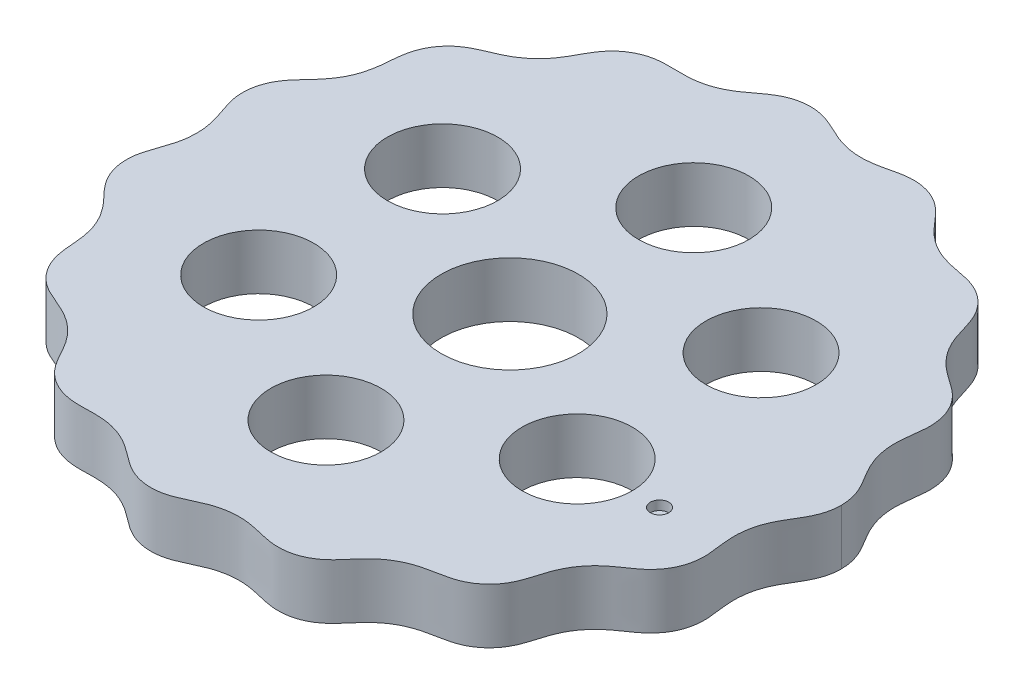
ISO-10303-21;
HEADER;
FILE_DESCRIPTION(('STEP AP214'),'2;1');
FILE_NAME('part.step','',(''),(''),'','','');
FILE_SCHEMA(('AUTOMOTIVE_DESIGN { 1 0 10303 214 1 1 1 1 }'));
ENDSEC;
DATA;
#1=APPLICATION_CONTEXT('core data for automotive mechanical design processes');
#2=APPLICATION_PROTOCOL_DEFINITION('international standard','automotive_design',2000,#1);
#3=PRODUCT_CONTEXT('',#1,'mechanical');
#4=PRODUCT('Part','Part','',(#3));
#5=PRODUCT_RELATED_PRODUCT_CATEGORY('part','',(#4));
#6=PRODUCT_DEFINITION_FORMATION('','',#4);
#7=PRODUCT_DEFINITION_CONTEXT('part definition',#1,'design');
#8=PRODUCT_DEFINITION('design','',#6,#7);
#9=PRODUCT_DEFINITION_SHAPE('','',#8);
#10=(LENGTH_UNIT() NAMED_UNIT(*) SI_UNIT(.MILLI.,.METRE.));
#11=(NAMED_UNIT(*) PLANE_ANGLE_UNIT() SI_UNIT($,.RADIAN.));
#12=(NAMED_UNIT(*) SI_UNIT($,.STERADIAN.) SOLID_ANGLE_UNIT());
#13=UNCERTAINTY_MEASURE_WITH_UNIT(LENGTH_MEASURE(1.E-05),#10,'distance_accuracy_value','');
#14=(GEOMETRIC_REPRESENTATION_CONTEXT(3) GLOBAL_UNCERTAINTY_ASSIGNED_CONTEXT((#13)) GLOBAL_UNIT_ASSIGNED_CONTEXT((#10,
#11,#12)) REPRESENTATION_CONTEXT('',''));
#15=CARTESIAN_POINT('',(0.,0.,0.));
#16=DIRECTION('',(0.,0.,1.));
#17=DIRECTION('',(1.,0.,0.));
#18=AXIS2_PLACEMENT_3D('',#15,#16,#17);
#19=CARTESIAN_POINT('',(-35.05,6.,9.32696218690527E-12));
#20=CARTESIAN_POINT('',(-35.0499999998892,6.,0.594198712220902));
#21=CARTESIAN_POINT('',(-35.1913465120562,6.,1.78711982767264));
#22=CARTESIAN_POINT('',(-35.7745737882899,6.,3.47963326521063));
#23=CARTESIAN_POINT('',(-36.370656392762,6.,5.19330738173192));
#24=CARTESIAN_POINT('',(-36.4395745059833,6.,7.03029588725489));
#25=CARTESIAN_POINT('',(-35.9254904949425,6.,8.79622364001885));
#26=CARTESIAN_POINT('',(-34.8762951438896,6.,10.2952756537674));
#27=CARTESIAN_POINT('',(-33.5854700617784,6.,11.5493162046679));
#28=CARTESIAN_POINT('',(-32.4877066627104,6.,12.9692487656192));
#29=CARTESIAN_POINT('',(-31.7429571439539,6.,14.6069888477062));
#30=CARTESIAN_POINT('',(-31.3965653966145,6.,16.3684571477443));
#31=CARTESIAN_POINT('',(-31.3265352886967,6.,18.1655890316743));
#32=CARTESIAN_POINT('',(-30.9526112903441,6.,19.9544631608531));
#33=CARTESIAN_POINT('',(-30.0177309342568,6.,21.5384719808491));
#34=CARTESIAN_POINT('',(-28.6321107294511,6.,22.7474902594258));
#35=CARTESIAN_POINT('',(-26.9684972059925,6.,23.4758048945092));
#36=CARTESIAN_POINT('',(-24.7570576622411,6.,24.3803877936909));
#37=CARTESIAN_POINT('',(-22.9112517705363,6.,25.9835895465123));
#38=CARTESIAN_POINT('',(-21.7348969348737,6.,28.0634777360799));
#39=CARTESIAN_POINT('',(-20.8793460189135,6.,29.6605139568622));
#40=CARTESIAN_POINT('',(-19.5893345538051,6.,30.9697358449682));
#41=CARTESIAN_POINT('',(-17.9506188599872,6.,31.8040646366244));
#42=CARTESIAN_POINT('',(-16.1381628593216,6.,32.0666998195313));
#43=CARTESIAN_POINT('',(-14.3403811434947,6.,31.9481438558153));
#44=CARTESIAN_POINT('',(-12.5497470424179,6.,32.0565924432155));
#45=CARTESIAN_POINT('',(-10.825868457719,6.,32.5716843435534));
#46=CARTESIAN_POINT('',(-9.27045661127403,6.,33.470271575087));
#47=CARTESIAN_POINT('',(-7.88735838734216,6.,34.6160917158558));
#48=CARTESIAN_POINT('',(-6.32792326907632,6.,35.566471434636));
#49=CARTESIAN_POINT('',(-4.53328198655415,6.,35.9699050702021));
#50=CARTESIAN_POINT('',(-2.70292921010654,6.,35.7895233497481));
#51=CARTESIAN_POINT('',(-1.03579759542578,6.,35.0636998469043));
#52=CARTESIAN_POINT('',(0.572152539145945,6.,34.2736511031319));
#53=CARTESIAN_POINT('',(2.31315420309511,6.,33.822136750088));
#54=CARTESIAN_POINT('',(4.11223072383569,6.,33.7899259876357));
#55=CARTESIAN_POINT('',(5.86627955125585,6.,34.1520112916324));
#56=CARTESIAN_POINT('',(7.61907713235213,6.,34.6037655657108));
#57=CARTESIAN_POINT('',(9.45536171394892,6.,34.5618632272122));
#58=CARTESIAN_POINT('',(11.1856343970663,6.,33.9385608736506));
#59=CARTESIAN_POINT('',(12.6200769235361,6.,32.7974342126942));
#60=CARTESIAN_POINT('',(13.7402024322461,6.,31.3837399155461));
#61=CARTESIAN_POINT('',(15.0003772119089,6.,30.1081805798537));
#62=CARTESIAN_POINT('',(16.5216437127923,6.,29.1475096031536));
#63=CARTESIAN_POINT('',(18.2225137560446,6.,28.5671554071713));
#64=CARTESIAN_POINT('',(19.996356323046,6.,28.2983181896908));
#65=CARTESIAN_POINT('',(22.3427942462049,6.,27.6504260298381));
#66=CARTESIAN_POINT('',(24.2011714080777,6.,25.896958922492));
#67=CARTESIAN_POINT('',(25.0056239565397,6.,23.6053486952171));
#68=CARTESIAN_POINT('',(25.4804410916593,6.,21.8774790408125));
#69=CARTESIAN_POINT('',(26.2849706752904,6.,20.2692714737283));
#70=CARTESIAN_POINT('',(27.4434246095972,6.,18.8926486785662));
#71=CARTESIAN_POINT('',(28.8726076272551,6.,17.8118803078229));
#72=CARTESIAN_POINT('',(30.3879451239351,6.,16.825917608955));
#73=CARTESIAN_POINT('',(31.6155427164027,6.,15.4611393344032));
#74=CARTESIAN_POINT('',(32.3457918338397,6.,13.7734509022635));
#75=CARTESIAN_POINT('',(32.4979162013361,6.,11.945393512076));
#76=CARTESIAN_POINT('',(32.204983179982,6.,10.1635179830524));
#77=CARTESIAN_POINT('',(32.0757754972111,6.,8.37582766732209));
#78=CARTESIAN_POINT('',(32.3517418709203,6.,6.59786117174831));
#79=CARTESIAN_POINT('',(33.0335892363525,6.,4.93469078106266));
#80=CARTESIAN_POINT('',(34.0120354721736,6.,3.43122980617509));
#81=CARTESIAN_POINT('',(34.8553368030006,6.,1.81785079322302));
#82=CARTESIAN_POINT('',(35.0500000000165,6.,0.601878761075715));
#83=CARTESIAN_POINT('',(35.05,6.,-1.36507195783586E-12));
#84=B_SPLINE_CURVE_WITH_KNOTS('',3,(#19,#20,#21,#22,#23,#24,#25,#26,#27,#28,#29,#30,#31,#32,#33,
#34,#35,#36,#37,#38,#39,#40,#41,#42,#43,#44,#45,#46,#47,#48,#49,#50,#51,#52,#53,#54,#55,#56,#57,
#58,#59,#60,#61,#62,#63,#64,#65,#66,#67,#68,#69,#70,#71,#72,#73,#74,#75,#76,#77,#78,#79,#80,#81,
#82,#83),.UNSPECIFIED.,.F.,.F.,(4,1,1,1,1,1,1,1,1,1,1,1,1,1,1,1,1,1,1,1,1,1,1,1,1,1,1,1,1,1,1,1,
1,1,1,1,1,1,1,1,1,1,1,1,1,1,1,1,1,1,1,1,1,1,1,1,1,1,1,1,1,1,4),(0.0723695662334952,
0.0856649243269336,0.0989602824203721,0.112255640513811,0.125550998607249,0.138846356700688,
0.152141714794126,0.165437072887564,0.178732430981003,0.192027789074441,0.20532314716788,
0.218618505261318,0.231913863354757,0.245209221448195,0.258504579541634,0.271799937635072,
0.285095295728511,0.311686011915388,0.324981370008826,0.338276728102265,0.351572086195703,
0.364867444289141,0.37816280238258,0.391458160476018,0.404753518569457,0.418048876662895,
0.431344234756334,0.444639592849772,0.457934950943211,0.471230309036649,0.484525667130088,
0.497821025223526,0.511116383316965,0.524411741410403,0.537707099503842,0.55100245759728,
0.564297815690718,0.577593173784157,0.590888531877595,0.604183889971034,0.617479248064472,
0.630774606157911,0.644069964251349,0.657365322344788,0.670660680438226,0.683956038531665,
0.710546754718541,0.72384211281198,0.737137470905418,0.750432828998857,0.763728187092295,
0.777023545185734,0.790318903279172,0.803614261372611,0.816909619466049,0.830204977559488,
0.843500335652926,0.856795693746365,0.870091051839803,0.883386409933242,0.89668176802668,
0.909977126120118,0.923272484213557),.UNSPECIFIED.);
#85=DIRECTION('',(0.,-1.,0.));
#86=VECTOR('',#85,1.);
#87=SURFACE_OF_LINEAR_EXTRUSION('',#84,#86);
#88=CARTESIAN_POINT('',(-35.05,0.,9.32696218690527E-12));
#89=CARTESIAN_POINT('',(-35.0499999998892,0.,0.594198712220902));
#90=CARTESIAN_POINT('',(-35.1913465120562,0.,1.78711982767264));
#91=CARTESIAN_POINT('',(-35.7745737882899,0.,3.47963326521063));
#92=CARTESIAN_POINT('',(-36.370656392762,0.,5.19330738173192));
#93=CARTESIAN_POINT('',(-36.4395745059833,0.,7.03029588725489));
#94=CARTESIAN_POINT('',(-35.9254904949425,0.,8.79622364001885));
#95=CARTESIAN_POINT('',(-34.8762951438896,0.,10.2952756537674));
#96=CARTESIAN_POINT('',(-33.5854700617784,0.,11.5493162046679));
#97=CARTESIAN_POINT('',(-32.4877066627104,0.,12.9692487656192));
#98=CARTESIAN_POINT('',(-31.7429571439539,0.,14.6069888477062));
#99=CARTESIAN_POINT('',(-31.3965653966145,0.,16.3684571477443));
#100=CARTESIAN_POINT('',(-31.3265352886967,0.,18.1655890316743));
#101=CARTESIAN_POINT('',(-30.9526112903441,0.,19.9544631608531));
#102=CARTESIAN_POINT('',(-30.0177309342568,0.,21.5384719808491));
#103=CARTESIAN_POINT('',(-28.6321107294511,0.,22.7474902594258));
#104=CARTESIAN_POINT('',(-26.9684972059925,0.,23.4758048945092));
#105=CARTESIAN_POINT('',(-24.7570576622411,0.,24.3803877936909));
#106=CARTESIAN_POINT('',(-22.9112517705363,0.,25.9835895465123));
#107=CARTESIAN_POINT('',(-21.7348969348737,0.,28.0634777360799));
#108=CARTESIAN_POINT('',(-20.8793460189135,0.,29.6605139568622));
#109=CARTESIAN_POINT('',(-19.5893345538051,0.,30.9697358449682));
#110=CARTESIAN_POINT('',(-17.9506188599872,0.,31.8040646366244));
#111=CARTESIAN_POINT('',(-16.1381628593216,0.,32.0666998195313));
#112=CARTESIAN_POINT('',(-14.3403811434947,0.,31.9481438558153));
#113=CARTESIAN_POINT('',(-12.5497470424179,0.,32.0565924432155));
#114=CARTESIAN_POINT('',(-10.825868457719,0.,32.5716843435534));
#115=CARTESIAN_POINT('',(-9.27045661127403,0.,33.470271575087));
#116=CARTESIAN_POINT('',(-7.88735838734216,0.,34.6160917158558));
#117=CARTESIAN_POINT('',(-6.32792326907632,0.,35.566471434636));
#118=CARTESIAN_POINT('',(-4.53328198655415,0.,35.9699050702021));
#119=CARTESIAN_POINT('',(-2.70292921010654,0.,35.7895233497481));
#120=CARTESIAN_POINT('',(-1.03579759542578,0.,35.0636998469043));
#121=CARTESIAN_POINT('',(0.572152539145945,0.,34.2736511031319));
#122=CARTESIAN_POINT('',(2.31315420309511,0.,33.822136750088));
#123=CARTESIAN_POINT('',(4.11223072383569,0.,33.7899259876357));
#124=CARTESIAN_POINT('',(5.86627955125585,0.,34.1520112916324));
#125=CARTESIAN_POINT('',(7.61907713235213,0.,34.6037655657108));
#126=CARTESIAN_POINT('',(9.45536171394892,0.,34.5618632272122));
#127=CARTESIAN_POINT('',(11.1856343970663,0.,33.9385608736506));
#128=CARTESIAN_POINT('',(12.6200769235361,0.,32.7974342126942));
#129=CARTESIAN_POINT('',(13.7402024322461,0.,31.3837399155461));
#130=CARTESIAN_POINT('',(15.0003772119089,0.,30.1081805798537));
#131=CARTESIAN_POINT('',(16.5216437127923,0.,29.1475096031536));
#132=CARTESIAN_POINT('',(18.2225137560446,0.,28.5671554071713));
#133=CARTESIAN_POINT('',(19.996356323046,0.,28.2983181896908));
#134=CARTESIAN_POINT('',(22.3427942462049,0.,27.6504260298381));
#135=CARTESIAN_POINT('',(24.2011714080777,0.,25.896958922492));
#136=CARTESIAN_POINT('',(25.0056239565397,0.,23.6053486952171));
#137=CARTESIAN_POINT('',(25.4804410916593,0.,21.8774790408125));
#138=CARTESIAN_POINT('',(26.2849706752904,0.,20.2692714737283));
#139=CARTESIAN_POINT('',(27.4434246095972,0.,18.8926486785662));
#140=CARTESIAN_POINT('',(28.8726076272551,0.,17.8118803078229));
#141=CARTESIAN_POINT('',(30.3879451239351,0.,16.825917608955));
#142=CARTESIAN_POINT('',(31.6155427164027,0.,15.4611393344032));
#143=CARTESIAN_POINT('',(32.3457918338397,0.,13.7734509022635));
#144=CARTESIAN_POINT('',(32.4979162013361,0.,11.945393512076));
#145=CARTESIAN_POINT('',(32.204983179982,0.,10.1635179830524));
#146=CARTESIAN_POINT('',(32.0757754972111,0.,8.37582766732209));
#147=CARTESIAN_POINT('',(32.3517418709203,0.,6.59786117174831));
#148=CARTESIAN_POINT('',(33.0335892363525,0.,4.93469078106266));
#149=CARTESIAN_POINT('',(34.0120354721736,0.,3.43122980617509));
#150=CARTESIAN_POINT('',(34.8553368030006,0.,1.81785079322302));
#151=CARTESIAN_POINT('',(35.0500000000165,0.,0.601878761075715));
#152=CARTESIAN_POINT('',(35.05,0.,-1.36507195783586E-12));
#153=B_SPLINE_CURVE_WITH_KNOTS('',3,(#88,#89,#90,#91,#92,#93,#94,#95,#96,#97,#98,#99,#100,#101,
#102,#103,#104,#105,#106,#107,#108,#109,#110,#111,#112,#113,#114,#115,#116,#117,#118,#119,#120,
#121,#122,#123,#124,#125,#126,#127,#128,#129,#130,#131,#132,#133,#134,#135,#136,#137,#138,#139,
#140,#141,#142,#143,#144,#145,#146,#147,#148,#149,#150,#151,#152),.UNSPECIFIED.,.F.,.F.,(4,1,1,
1,1,1,1,1,1,1,1,1,1,1,1,1,1,1,1,1,1,1,1,1,1,1,1,1,1,1,1,1,1,1,1,1,1,1,1,1,1,1,1,1,1,1,1,1,1,1,1,
1,1,1,1,1,1,1,1,1,1,1,4),(0.0723695662334952,0.0856649243269336,0.0989602824203721,
0.112255640513811,0.125550998607249,0.138846356700688,0.152141714794126,0.165437072887564,
0.178732430981003,0.192027789074441,0.20532314716788,0.218618505261318,0.231913863354757,
0.245209221448195,0.258504579541634,0.271799937635072,0.285095295728511,0.311686011915388,
0.324981370008826,0.338276728102265,0.351572086195703,0.364867444289141,0.37816280238258,
0.391458160476018,0.404753518569457,0.418048876662895,0.431344234756334,0.444639592849772,
0.457934950943211,0.471230309036649,0.484525667130088,0.497821025223526,0.511116383316965,
0.524411741410403,0.537707099503842,0.55100245759728,0.564297815690718,0.577593173784157,
0.590888531877595,0.604183889971034,0.617479248064472,0.630774606157911,0.644069964251349,
0.657365322344788,0.670660680438226,0.683956038531665,0.710546754718541,0.72384211281198,
0.737137470905418,0.750432828998857,0.763728187092295,0.777023545185734,0.790318903279172,
0.803614261372611,0.816909619466049,0.830204977559488,0.843500335652926,0.856795693746365,
0.870091051839803,0.883386409933242,0.89668176802668,0.909977126120118,0.923272484213557),.UNSPECIFIED.);
#154=CARTESIAN_POINT('',(-35.05,0.,-9.36402296380678E-12));
#155=VERTEX_POINT('',#154);
#156=CARTESIAN_POINT('',(35.05,0.,6.60917192524854E-13));
#157=VERTEX_POINT('',#156);
#158=EDGE_CURVE('E79',#155,#157,#153,.T.);
#159=ORIENTED_EDGE('',*,*,#158,.T.);
#160=DIRECTION('',(0.,-1.,0.));
#161=VECTOR('',#160,1.);
#162=CARTESIAN_POINT('',(35.05,6.,6.60917192524854E-13));
#163=LINE('',#162,#161);
#164=CARTESIAN_POINT('',(35.05,6.,6.60917192524854E-13));
#165=VERTEX_POINT('',#164);
#166=EDGE_CURVE('E11',#165,#157,#163,.T.);
#167=ORIENTED_EDGE('',*,*,#166,.F.);
#168=CARTESIAN_POINT('',(-35.05,6.,-9.36402296380678E-12));
#169=VERTEX_POINT('',#168);
#170=EDGE_CURVE('E78',#169,#165,#84,.T.);
#171=ORIENTED_EDGE('',*,*,#170,.F.);
#172=DIRECTION('',(0.,-1.,0.));
#173=VECTOR('',#172,1.);
#174=CARTESIAN_POINT('',(-35.05,6.,-9.36402296380678E-12));
#175=LINE('',#174,#173);
#176=EDGE_CURVE('E55',#169,#155,#175,.T.);
#177=ORIENTED_EDGE('',*,*,#176,.T.);
#178=EDGE_LOOP('',(#159,#167,#171,#177));
#179=FACE_BOUND('',#178,.T.);
#180=ADVANCED_FACE('F45',(#179),#87,.F.);
#181=CARTESIAN_POINT('',(35.05,6.,6.60917192524854E-13));
#182=CARTESIAN_POINT('',(35.050000000008,6.,-0.60187876105695));
#183=CARTESIAN_POINT('',(34.8553368030063,6.,-1.8178507931463));
#184=CARTESIAN_POINT('',(34.0120354721754,6.,-3.43122980612244));
#185=CARTESIAN_POINT('',(33.0335892363569,6.,-4.93469078100456));
#186=CARTESIAN_POINT('',(32.3517418709257,6.,-6.59786117169246));
#187=CARTESIAN_POINT('',(32.0757754972181,6.,-8.37582766726602));
#188=CARTESIAN_POINT('',(32.2049831799905,6.,-10.1635179829964));
#189=CARTESIAN_POINT('',(32.497916201346,6.,-11.9453935120196));
#190=CARTESIAN_POINT('',(32.3457918338513,6.,-13.7734509022073));
#191=CARTESIAN_POINT('',(31.6155427164156,6.,-15.4611393343476));
#192=CARTESIAN_POINT('',(30.3879451239491,6.,-16.8259176089004));
#193=CARTESIAN_POINT('',(28.87260762727,6.,-17.8118803077696));
#194=CARTESIAN_POINT('',(27.4434246096129,6.,-18.8926486785141));
#195=CARTESIAN_POINT('',(26.2849706753074,6.,-20.2692714736771));
#196=CARTESIAN_POINT('',(25.4804410916775,6.,-21.877479040762));
#197=CARTESIAN_POINT('',(25.0056239565594,6.,-23.605348695167));
#198=CARTESIAN_POINT('',(24.2011714080993,6.,-25.8969589224426));
#199=CARTESIAN_POINT('',(22.3427942462279,6.,-27.6504260297902));
#200=CARTESIAN_POINT('',(19.9963563230696,6.,-28.2983181896449));
#201=CARTESIAN_POINT('',(18.2225137560684,6.,-28.5671554071269));
#202=CARTESIAN_POINT('',(16.5216437128166,6.,-29.1475096031106));
#203=CARTESIAN_POINT('',(15.000377211934,6.,-30.108180579812));
#204=CARTESIAN_POINT('',(13.7402024322723,6.,-31.3837399155055));
#205=CARTESIAN_POINT('',(12.6200769235635,6.,-32.7974342126544));
#206=CARTESIAN_POINT('',(11.1856343970946,6.,-33.938560873612));
#207=CARTESIAN_POINT('',(9.45536171397777,6.,-34.5618632271751));
#208=CARTESIAN_POINT('',(7.61907713238102,6.,-34.6037655656752));
#209=CARTESIAN_POINT('',(5.86627955128436,6.,-34.1520112915984));
#210=CARTESIAN_POINT('',(4.11223072386389,6.,-33.7899259876031));
#211=CARTESIAN_POINT('',(2.31315420312334,6.,-33.8221367500569));
#212=CARTESIAN_POINT('',(0.572152539174554,6.,-34.2736511031022));
#213=CARTESIAN_POINT('',(-1.03579759539652,6.,-35.0636998468759));
#214=CARTESIAN_POINT('',(-2.70292921007666,6.,-35.7895233497211));
#215=CARTESIAN_POINT('',(-4.53328198652413,6.,-35.9699050701767));
#216=CARTESIAN_POINT('',(-6.32792326904664,6.,-35.5664714346121));
#217=CARTESIAN_POINT('',(-7.88735838731326,6.,-34.6160917158331));
#218=CARTESIAN_POINT('',(-9.27045661124609,6.,-33.4702715750656));
#219=CARTESIAN_POINT('',(-10.8258684576919,6.,-32.5716843435332));
#220=CARTESIAN_POINT('',(-12.5497470423912,6.,-32.0565924431967));
#221=CARTESIAN_POINT('',(-14.340381143468,6.,-31.9481438557981));
#222=CARTESIAN_POINT('',(-16.1381628592948,6.,-32.0666998195155));
#223=CARTESIAN_POINT('',(-17.9506188599606,6.,-31.8040646366102));
#224=CARTESIAN_POINT('',(-19.5893345537793,6.,-30.9697358449554));
#225=CARTESIAN_POINT('',(-20.8793460188887,6.,-29.6605139568504));
#226=CARTESIAN_POINT('',(-21.7348969348503,6.,-28.0634777360689));
#227=CARTESIAN_POINT('',(-22.9112517705146,6.,-25.9835895465022));
#228=CARTESIAN_POINT('',(-24.7570576622207,6.,-24.3803877936823));
#229=CARTESIAN_POINT('',(-26.9684972059729,6.,-23.4758048945025));
#230=CARTESIAN_POINT('',(-28.6321107294321,6.,-22.7474902594205));
#231=CARTESIAN_POINT('',(-30.0177309342388,6.,-21.538471980845));
#232=CARTESIAN_POINT('',(-30.9526112903274,6.,-19.9544631608497));
#233=CARTESIAN_POINT('',(-31.3265352886815,6.,-18.1655890316712));
#234=CARTESIAN_POINT('',(-31.3965653966008,6.,-16.3684571477413));
#235=CARTESIAN_POINT('',(-31.7429571439417,6.,-14.6069888477035));
#236=CARTESIAN_POINT('',(-32.4877066626996,6.,-12.9692487656171));
#237=CARTESIAN_POINT('',(-33.5854700617688,6.,-11.5493162046667));
#238=CARTESIAN_POINT('',(-34.876295143881,6.,-10.2952756537673));
#239=CARTESIAN_POINT('',(-35.9254904949351,6.,-8.79622364001962));
#240=CARTESIAN_POINT('',(-36.4395745059775,6.,-7.0302958872561));
#241=CARTESIAN_POINT('',(-36.3706563927577,6.,-5.19330738173307));
#242=CARTESIAN_POINT('',(-35.774573788287,6.,-3.47963326521128));
#243=CARTESIAN_POINT('',(-35.1913465120546,6.,-1.7871198276728));
#244=CARTESIAN_POINT('',(-35.0499999998887,6.,-0.59419871222094));
#245=CARTESIAN_POINT('',(-35.05,6.,-9.36402296380678E-12));
#246=B_SPLINE_CURVE_WITH_KNOTS('',3,(#181,#182,#183,#184,#185,#186,#187,#188,#189,#190,#191,
#192,#193,#194,#195,#196,#197,#198,#199,#200,#201,#202,#203,#204,#205,#206,#207,#208,#209,#210,
#211,#212,#213,#214,#215,#216,#217,#218,#219,#220,#221,#222,#223,#224,#225,#226,#227,#228,#229,
#230,#231,#232,#233,#234,#235,#236,#237,#238,#239,#240,#241,#242,#243,#244,#245),.UNSPECIFIED.,
.F.,.F.,(4,1,1,1,1,1,1,1,1,1,1,1,1,1,1,1,1,1,1,1,1,1,1,1,1,1,1,1,1,1,1,1,1,1,1,1,1,1,1,1,1,1,1,
1,1,1,1,1,1,1,1,1,1,1,1,1,1,1,1,1,1,1,4),(0.0723695662334952,0.0856649243269337,
0.0989602824203721,0.11225564051381,0.125550998607249,0.138846356700688,0.152141714794126,
0.165437072887564,0.178732430981003,0.192027789074441,0.20532314716788,0.218618505261318,
0.231913863354757,0.245209221448195,0.258504579541634,0.271799937635072,0.285095295728511,
0.311686011915388,0.324981370008826,0.338276728102264,0.351572086195703,0.364867444289141,
0.37816280238258,0.391458160476018,0.404753518569457,0.418048876662895,0.431344234756334,
0.444639592849772,0.457934950943211,0.471230309036649,0.484525667130088,0.497821025223526,
0.511116383316965,0.524411741410403,0.537707099503841,0.55100245759728,0.564297815690718,
0.577593173784157,0.590888531877595,0.604183889971034,0.617479248064472,0.630774606157911,
0.644069964251349,0.657365322344788,0.670660680438226,0.683956038531665,0.710546754718541,
0.72384211281198,0.737137470905418,0.750432828998857,0.763728187092295,0.777023545185734,
0.790318903279172,0.803614261372611,0.816909619466049,0.830204977559488,0.843500335652926,
0.856795693746365,0.870091051839803,0.883386409933242,0.89668176802668,0.909977126120118,
0.923272484213557),.UNSPECIFIED.);
#247=DIRECTION('',(0.,-1.,0.));
#248=VECTOR('',#247,1.);
#249=SURFACE_OF_LINEAR_EXTRUSION('',#246,#248);
#250=CARTESIAN_POINT('',(35.05,0.,6.60917192524854E-13));
#251=CARTESIAN_POINT('',(35.050000000008,0.,-0.60187876105695));
#252=CARTESIAN_POINT('',(34.8553368030063,0.,-1.8178507931463));
#253=CARTESIAN_POINT('',(34.0120354721754,0.,-3.43122980612244));
#254=CARTESIAN_POINT('',(33.0335892363569,0.,-4.93469078100456));
#255=CARTESIAN_POINT('',(32.3517418709257,0.,-6.59786117169246));
#256=CARTESIAN_POINT('',(32.0757754972181,0.,-8.37582766726602));
#257=CARTESIAN_POINT('',(32.2049831799905,0.,-10.1635179829964));
#258=CARTESIAN_POINT('',(32.497916201346,0.,-11.9453935120196));
#259=CARTESIAN_POINT('',(32.3457918338513,0.,-13.7734509022073));
#260=CARTESIAN_POINT('',(31.6155427164156,0.,-15.4611393343476));
#261=CARTESIAN_POINT('',(30.3879451239491,0.,-16.8259176089004));
#262=CARTESIAN_POINT('',(28.87260762727,0.,-17.8118803077696));
#263=CARTESIAN_POINT('',(27.4434246096129,0.,-18.8926486785141));
#264=CARTESIAN_POINT('',(26.2849706753074,0.,-20.2692714736771));
#265=CARTESIAN_POINT('',(25.4804410916775,0.,-21.877479040762));
#266=CARTESIAN_POINT('',(25.0056239565594,0.,-23.605348695167));
#267=CARTESIAN_POINT('',(24.2011714080993,0.,-25.8969589224426));
#268=CARTESIAN_POINT('',(22.3427942462279,0.,-27.6504260297902));
#269=CARTESIAN_POINT('',(19.9963563230696,0.,-28.2983181896449));
#270=CARTESIAN_POINT('',(18.2225137560684,0.,-28.5671554071269));
#271=CARTESIAN_POINT('',(16.5216437128166,0.,-29.1475096031106));
#272=CARTESIAN_POINT('',(15.000377211934,0.,-30.108180579812));
#273=CARTESIAN_POINT('',(13.7402024322723,0.,-31.3837399155055));
#274=CARTESIAN_POINT('',(12.6200769235635,0.,-32.7974342126544));
#275=CARTESIAN_POINT('',(11.1856343970946,0.,-33.938560873612));
#276=CARTESIAN_POINT('',(9.45536171397777,0.,-34.5618632271751));
#277=CARTESIAN_POINT('',(7.61907713238102,0.,-34.6037655656752));
#278=CARTESIAN_POINT('',(5.86627955128436,0.,-34.1520112915984));
#279=CARTESIAN_POINT('',(4.11223072386389,0.,-33.7899259876031));
#280=CARTESIAN_POINT('',(2.31315420312334,0.,-33.8221367500569));
#281=CARTESIAN_POINT('',(0.572152539174554,0.,-34.2736511031022));
#282=CARTESIAN_POINT('',(-1.03579759539652,0.,-35.0636998468759));
#283=CARTESIAN_POINT('',(-2.70292921007666,0.,-35.7895233497211));
#284=CARTESIAN_POINT('',(-4.53328198652413,0.,-35.9699050701767));
#285=CARTESIAN_POINT('',(-6.32792326904664,0.,-35.5664714346121));
#286=CARTESIAN_POINT('',(-7.88735838731326,0.,-34.6160917158331));
#287=CARTESIAN_POINT('',(-9.27045661124609,0.,-33.4702715750656));
#288=CARTESIAN_POINT('',(-10.8258684576919,0.,-32.5716843435332));
#289=CARTESIAN_POINT('',(-12.5497470423912,0.,-32.0565924431967));
#290=CARTESIAN_POINT('',(-14.340381143468,0.,-31.9481438557981));
#291=CARTESIAN_POINT('',(-16.1381628592948,0.,-32.0666998195155));
#292=CARTESIAN_POINT('',(-17.9506188599606,0.,-31.8040646366102));
#293=CARTESIAN_POINT('',(-19.5893345537793,0.,-30.9697358449554));
#294=CARTESIAN_POINT('',(-20.8793460188887,0.,-29.6605139568504));
#295=CARTESIAN_POINT('',(-21.7348969348503,0.,-28.0634777360689));
#296=CARTESIAN_POINT('',(-22.9112517705146,0.,-25.9835895465022));
#297=CARTESIAN_POINT('',(-24.7570576622207,0.,-24.3803877936823));
#298=CARTESIAN_POINT('',(-26.9684972059729,0.,-23.4758048945025));
#299=CARTESIAN_POINT('',(-28.6321107294321,0.,-22.7474902594205));
#300=CARTESIAN_POINT('',(-30.0177309342388,0.,-21.538471980845));
#301=CARTESIAN_POINT('',(-30.9526112903274,0.,-19.9544631608497));
#302=CARTESIAN_POINT('',(-31.3265352886815,0.,-18.1655890316712));
#303=CARTESIAN_POINT('',(-31.3965653966008,0.,-16.3684571477413));
#304=CARTESIAN_POINT('',(-31.7429571439417,0.,-14.6069888477035));
#305=CARTESIAN_POINT('',(-32.4877066626996,0.,-12.9692487656171));
#306=CARTESIAN_POINT('',(-33.5854700617688,0.,-11.5493162046667));
#307=CARTESIAN_POINT('',(-34.876295143881,0.,-10.2952756537673));
#308=CARTESIAN_POINT('',(-35.9254904949351,0.,-8.79622364001962));
#309=CARTESIAN_POINT('',(-36.4395745059775,0.,-7.0302958872561));
#310=CARTESIAN_POINT('',(-36.3706563927577,0.,-5.19330738173307));
#311=CARTESIAN_POINT('',(-35.774573788287,0.,-3.47963326521128));
#312=CARTESIAN_POINT('',(-35.1913465120546,0.,-1.7871198276728));
#313=CARTESIAN_POINT('',(-35.0499999998887,0.,-0.59419871222094));
#314=CARTESIAN_POINT('',(-35.05,0.,-9.36402296380678E-12));
#315=B_SPLINE_CURVE_WITH_KNOTS('',3,(#250,#251,#252,#253,#254,#255,#256,#257,#258,#259,#260,
#261,#262,#263,#264,#265,#266,#267,#268,#269,#270,#271,#272,#273,#274,#275,#276,#277,#278,#279,
#280,#281,#282,#283,#284,#285,#286,#287,#288,#289,#290,#291,#292,#293,#294,#295,#296,#297,#298,
#299,#300,#301,#302,#303,#304,#305,#306,#307,#308,#309,#310,#311,#312,#313,#314),.UNSPECIFIED.,
.F.,.F.,(4,1,1,1,1,1,1,1,1,1,1,1,1,1,1,1,1,1,1,1,1,1,1,1,1,1,1,1,1,1,1,1,1,1,1,1,1,1,1,1,1,1,1,
1,1,1,1,1,1,1,1,1,1,1,1,1,1,1,1,1,1,1,4),(0.0723695662334952,0.0856649243269337,
0.0989602824203721,0.11225564051381,0.125550998607249,0.138846356700688,0.152141714794126,
0.165437072887564,0.178732430981003,0.192027789074441,0.20532314716788,0.218618505261318,
0.231913863354757,0.245209221448195,0.258504579541634,0.271799937635072,0.285095295728511,
0.311686011915388,0.324981370008826,0.338276728102264,0.351572086195703,0.364867444289141,
0.37816280238258,0.391458160476018,0.404753518569457,0.418048876662895,0.431344234756334,
0.444639592849772,0.457934950943211,0.471230309036649,0.484525667130088,0.497821025223526,
0.511116383316965,0.524411741410403,0.537707099503841,0.55100245759728,0.564297815690718,
0.577593173784157,0.590888531877595,0.604183889971034,0.617479248064472,0.630774606157911,
0.644069964251349,0.657365322344788,0.670660680438226,0.683956038531665,0.710546754718541,
0.72384211281198,0.737137470905418,0.750432828998857,0.763728187092295,0.777023545185734,
0.790318903279172,0.803614261372611,0.816909619466049,0.830204977559488,0.843500335652926,
0.856795693746365,0.870091051839803,0.883386409933242,0.89668176802668,0.909977126120118,
0.923272484213557),.UNSPECIFIED.);
#316=EDGE_CURVE('E70',#157,#155,#315,.T.);
#317=ORIENTED_EDGE('',*,*,#316,.T.);
#318=ORIENTED_EDGE('',*,*,#176,.F.);
#319=EDGE_CURVE('E62',#165,#169,#246,.T.);
#320=ORIENTED_EDGE('',*,*,#319,.F.);
#321=ORIENTED_EDGE('',*,*,#166,.T.);
#322=EDGE_LOOP('',(#317,#318,#320,#321));
#323=FACE_BOUND('',#322,.T.);
#324=ADVANCED_FACE('F73',(#323),#249,.F.);
#325=CARTESIAN_POINT('',(-1.04566117544395,6.,35.0529956400828));
#326=DIRECTION('',(0.,1.,0.));
#327=DIRECTION('',(0.,0.,1.));
#328=AXIS2_PLACEMENT_3D('',#325,#326,#327);
#329=PLANE('',#328);
#330=CARTESIAN_POINT('',(25.3714875404873,6.,10.0923907742718));
#331=DIRECTION('',(0.,1.,0.));
#332=DIRECTION('',(0.,0.,1.));
#333=AXIS2_PLACEMENT_3D('',#330,#331,#332);
#334=CIRCLE('',#333,1.);
#335=CARTESIAN_POINT('',(25.3714875404873,6.,11.0923907742718));
#336=VERTEX_POINT('',#335);
#337=EDGE_CURVE('E241',#336,#336,#334,.T.);
#338=ORIENTED_EDGE('',*,*,#337,.F.);
#339=EDGE_LOOP('',(#338));
#340=FACE_BOUND('',#339,.T.);
#341=CARTESIAN_POINT('',(-18.3205080756888,6.,-10.));
#342=DIRECTION('',(0.,1.,0.));
#343=DIRECTION('',(0.,0.,1.));
#344=AXIS2_PLACEMENT_3D('',#341,#342,#343);
#345=CIRCLE('',#344,6.);
#346=CARTESIAN_POINT('',(-18.3205080756888,6.,-4.));
#347=VERTEX_POINT('',#346);
#348=EDGE_CURVE('E246',#347,#347,#345,.T.);
#349=ORIENTED_EDGE('',*,*,#348,.F.);
#350=EDGE_LOOP('',(#349));
#351=FACE_BOUND('',#350,.T.);
#352=CARTESIAN_POINT('',(-18.3205080756888,6.,10.));
#353=DIRECTION('',(0.,1.,0.));
#354=DIRECTION('',(0.,0.,1.));
#355=AXIS2_PLACEMENT_3D('',#352,#353,#354);
#356=CIRCLE('',#355,6.);
#357=CARTESIAN_POINT('',(-18.3205080756888,6.,16.));
#358=VERTEX_POINT('',#357);
#359=EDGE_CURVE('E283',#358,#358,#356,.T.);
#360=ORIENTED_EDGE('',*,*,#359,.F.);
#361=EDGE_LOOP('',(#360));
#362=FACE_BOUND('',#361,.T.);
#363=CARTESIAN_POINT('',(-0.999999999999997,6.,20.));
#364=DIRECTION('',(0.,1.,0.));
#365=DIRECTION('',(0.,0.,1.));
#366=AXIS2_PLACEMENT_3D('',#363,#364,#365);
#367=CIRCLE('',#366,6.00000000000001);
#368=CARTESIAN_POINT('',(-0.999999999999997,6.,26.));
#369=VERTEX_POINT('',#368);
#370=EDGE_CURVE('E275',#369,#369,#367,.T.);
#371=ORIENTED_EDGE('',*,*,#370,.F.);
#372=EDGE_LOOP('',(#371));
#373=FACE_BOUND('',#372,.T.);
#374=CARTESIAN_POINT('',(16.3205080756888,6.,10.));
#375=DIRECTION('',(0.,1.,0.));
#376=DIRECTION('',(0.,0.,1.));
#377=AXIS2_PLACEMENT_3D('',#374,#375,#376);
#378=CIRCLE('',#377,6.00000000000001);
#379=CARTESIAN_POINT('',(16.3205080756888,6.,16.));
#380=VERTEX_POINT('',#379);
#381=EDGE_CURVE('E267',#380,#380,#378,.T.);
#382=ORIENTED_EDGE('',*,*,#381,.F.);
#383=EDGE_LOOP('',(#382));
#384=FACE_BOUND('',#383,.T.);
#385=CARTESIAN_POINT('',(16.3205080756888,6.,-10.));
#386=DIRECTION('',(0.,1.,0.));
#387=DIRECTION('',(0.,0.,1.));
#388=AXIS2_PLACEMENT_3D('',#385,#386,#387);
#389=CIRCLE('',#388,6.00000000000001);
#390=CARTESIAN_POINT('',(16.3205080756888,6.,-4.));
#391=VERTEX_POINT('',#390);
#392=EDGE_CURVE('E259',#391,#391,#389,.T.);
#393=ORIENTED_EDGE('',*,*,#392,.F.);
#394=EDGE_LOOP('',(#393));
#395=FACE_BOUND('',#394,.T.);
#396=CARTESIAN_POINT('',(-1.,6.,-20.));
#397=DIRECTION('',(0.,1.,0.));
#398=DIRECTION('',(0.,0.,1.));
#399=AXIS2_PLACEMENT_3D('',#396,#397,#398);
#400=CIRCLE('',#399,6.);
#401=CARTESIAN_POINT('',(-1.,6.,-14.));
#402=VERTEX_POINT('',#401);
#403=EDGE_CURVE('E251',#402,#402,#400,.T.);
#404=ORIENTED_EDGE('',*,*,#403,.F.);
#405=EDGE_LOOP('',(#404));
#406=FACE_BOUND('',#405,.T.);
#407=CARTESIAN_POINT('',(-1.,6.,0.));
#408=DIRECTION('',(0.,1.,0.));
#409=DIRECTION('',(0.,0.,1.));
#410=AXIS2_PLACEMENT_3D('',#407,#408,#409);
#411=CIRCLE('',#410,7.475);
#412=CARTESIAN_POINT('',(-1.,6.,7.475));
#413=VERTEX_POINT('',#412);
#414=EDGE_CURVE('E89',#413,#413,#411,.T.);
#415=ORIENTED_EDGE('',*,*,#414,.F.);
#416=EDGE_LOOP('',(#415));
#417=FACE_BOUND('',#416,.T.);
#418=ORIENTED_EDGE('',*,*,#170,.T.);
#419=ORIENTED_EDGE('',*,*,#319,.T.);
#420=EDGE_LOOP('',(#418,#419));
#421=FACE_BOUND('',#420,.T.);
#422=ADVANCED_FACE('F115',(#340,#351,#362,#373,#384,#395,#406,#417,#421),#329,.T.);
#423=CARTESIAN_POINT('',(-1.04566117544395,0.,35.0529956400828));
#424=DIRECTION('',(0.,1.,0.));
#425=DIRECTION('',(0.,0.,1.));
#426=AXIS2_PLACEMENT_3D('',#423,#424,#425);
#427=PLANE('',#426);
#428=CARTESIAN_POINT('',(-18.3205080756888,0.,-10.));
#429=DIRECTION('',(0.,1.,0.));
#430=DIRECTION('',(0.,0.,1.));
#431=AXIS2_PLACEMENT_3D('',#428,#429,#430);
#432=CIRCLE('',#431,6.);
#433=CARTESIAN_POINT('',(-18.3205080756888,0.,-4.));
#434=VERTEX_POINT('',#433);
#435=EDGE_CURVE('E240',#434,#434,#432,.T.);
#436=ORIENTED_EDGE('',*,*,#435,.T.);
#437=EDGE_LOOP('',(#436));
#438=FACE_BOUND('',#437,.T.);
#439=CARTESIAN_POINT('',(-18.3205080756888,0.,10.));
#440=DIRECTION('',(0.,1.,0.));
#441=DIRECTION('',(0.,0.,1.));
#442=AXIS2_PLACEMENT_3D('',#439,#440,#441);
#443=CIRCLE('',#442,6.);
#444=CARTESIAN_POINT('',(-18.3205080756888,0.,16.));
#445=VERTEX_POINT('',#444);
#446=EDGE_CURVE('E287',#445,#445,#443,.T.);
#447=ORIENTED_EDGE('',*,*,#446,.T.);
#448=EDGE_LOOP('',(#447));
#449=FACE_BOUND('',#448,.T.);
#450=CARTESIAN_POINT('',(-0.999999999999997,0.,20.));
#451=DIRECTION('',(0.,1.,0.));
#452=DIRECTION('',(0.,0.,1.));
#453=AXIS2_PLACEMENT_3D('',#450,#451,#452);
#454=CIRCLE('',#453,6.00000000000001);
#455=CARTESIAN_POINT('',(-0.999999999999997,0.,26.));
#456=VERTEX_POINT('',#455);
#457=EDGE_CURVE('E279',#456,#456,#454,.T.);
#458=ORIENTED_EDGE('',*,*,#457,.T.);
#459=EDGE_LOOP('',(#458));
#460=FACE_BOUND('',#459,.T.);
#461=CARTESIAN_POINT('',(16.3205080756888,0.,10.));
#462=DIRECTION('',(0.,1.,0.));
#463=DIRECTION('',(0.,0.,1.));
#464=AXIS2_PLACEMENT_3D('',#461,#462,#463);
#465=CIRCLE('',#464,6.00000000000001);
#466=CARTESIAN_POINT('',(16.3205080756888,0.,16.));
#467=VERTEX_POINT('',#466);
#468=EDGE_CURVE('E271',#467,#467,#465,.T.);
#469=ORIENTED_EDGE('',*,*,#468,.T.);
#470=EDGE_LOOP('',(#469));
#471=FACE_BOUND('',#470,.T.);
#472=CARTESIAN_POINT('',(16.3205080756888,0.,-10.));
#473=DIRECTION('',(0.,1.,0.));
#474=DIRECTION('',(0.,0.,1.));
#475=AXIS2_PLACEMENT_3D('',#472,#473,#474);
#476=CIRCLE('',#475,6.00000000000001);
#477=CARTESIAN_POINT('',(16.3205080756888,0.,-4.));
#478=VERTEX_POINT('',#477);
#479=EDGE_CURVE('E263',#478,#478,#476,.T.);
#480=ORIENTED_EDGE('',*,*,#479,.T.);
#481=EDGE_LOOP('',(#480));
#482=FACE_BOUND('',#481,.T.);
#483=CARTESIAN_POINT('',(-1.,0.,-20.));
#484=DIRECTION('',(0.,1.,0.));
#485=DIRECTION('',(0.,0.,1.));
#486=AXIS2_PLACEMENT_3D('',#483,#484,#485);
#487=CIRCLE('',#486,6.);
#488=CARTESIAN_POINT('',(-1.,0.,-14.));
#489=VERTEX_POINT('',#488);
#490=EDGE_CURVE('E255',#489,#489,#487,.T.);
#491=ORIENTED_EDGE('',*,*,#490,.T.);
#492=EDGE_LOOP('',(#491));
#493=FACE_BOUND('',#492,.T.);
#494=CARTESIAN_POINT('',(-1.,0.,0.));
#495=DIRECTION('',(0.,1.,0.));
#496=DIRECTION('',(0.,0.,1.));
#497=AXIS2_PLACEMENT_3D('',#494,#495,#496);
#498=CIRCLE('',#497,7.475);
#499=CARTESIAN_POINT('',(-1.,0.,7.475));
#500=VERTEX_POINT('',#499);
#501=EDGE_CURVE('E85',#500,#500,#498,.T.);
#502=ORIENTED_EDGE('',*,*,#501,.T.);
#503=EDGE_LOOP('',(#502));
#504=FACE_BOUND('',#503,.T.);
#505=ORIENTED_EDGE('',*,*,#158,.F.);
#506=ORIENTED_EDGE('',*,*,#316,.F.);
#507=EDGE_LOOP('',(#505,#506));
#508=FACE_BOUND('',#507,.T.);
#509=ADVANCED_FACE('F83',(#438,#449,#460,#471,#482,#493,#504,#508),#427,.F.);
#510=CARTESIAN_POINT('',(-1.,0.,0.));
#511=DIRECTION('',(0.,1.,0.));
#512=DIRECTION('',(0.,0.,1.));
#513=AXIS2_PLACEMENT_3D('',#510,#511,#512);
#514=CYLINDRICAL_SURFACE('',#513,7.475);
#515=ORIENTED_EDGE('',*,*,#501,.F.);
#516=EDGE_LOOP('',(#515));
#517=FACE_BOUND('',#516,.T.);
#518=ORIENTED_EDGE('',*,*,#414,.T.);
#519=EDGE_LOOP('',(#518));
#520=FACE_BOUND('',#519,.T.);
#521=ADVANCED_FACE('F118',(#517,#520),#514,.F.);
#522=CARTESIAN_POINT('',(-1.,0.,-20.));
#523=DIRECTION('',(0.,1.,0.));
#524=DIRECTION('',(0.,0.,1.));
#525=AXIS2_PLACEMENT_3D('',#522,#523,#524);
#526=CYLINDRICAL_SURFACE('',#525,6.);
#527=ORIENTED_EDGE('',*,*,#490,.F.);
#528=EDGE_LOOP('',(#527));
#529=FACE_BOUND('',#528,.T.);
#530=ORIENTED_EDGE('',*,*,#403,.T.);
#531=EDGE_LOOP('',(#530));
#532=FACE_BOUND('',#531,.T.);
#533=ADVANCED_FACE('F125',(#529,#532),#526,.F.);
#534=CARTESIAN_POINT('',(16.3205080756888,0.,-10.));
#535=DIRECTION('',(0.,1.,0.));
#536=DIRECTION('',(0.,0.,1.));
#537=AXIS2_PLACEMENT_3D('',#534,#535,#536);
#538=CYLINDRICAL_SURFACE('',#537,6.00000000000001);
#539=ORIENTED_EDGE('',*,*,#479,.F.);
#540=EDGE_LOOP('',(#539));
#541=FACE_BOUND('',#540,.T.);
#542=ORIENTED_EDGE('',*,*,#392,.T.);
#543=EDGE_LOOP('',(#542));
#544=FACE_BOUND('',#543,.T.);
#545=ADVANCED_FACE('F143',(#541,#544),#538,.F.);
#546=CARTESIAN_POINT('',(16.3205080756888,0.,10.));
#547=DIRECTION('',(0.,1.,0.));
#548=DIRECTION('',(0.,0.,1.));
#549=AXIS2_PLACEMENT_3D('',#546,#547,#548);
#550=CYLINDRICAL_SURFACE('',#549,6.00000000000001);
#551=ORIENTED_EDGE('',*,*,#468,.F.);
#552=EDGE_LOOP('',(#551));
#553=FACE_BOUND('',#552,.T.);
#554=ORIENTED_EDGE('',*,*,#381,.T.);
#555=EDGE_LOOP('',(#554));
#556=FACE_BOUND('',#555,.T.);
#557=ADVANCED_FACE('F139',(#553,#556),#550,.F.);
#558=CARTESIAN_POINT('',(-0.999999999999997,0.,20.));
#559=DIRECTION('',(0.,1.,0.));
#560=DIRECTION('',(0.,0.,1.));
#561=AXIS2_PLACEMENT_3D('',#558,#559,#560);
#562=CYLINDRICAL_SURFACE('',#561,6.00000000000001);
#563=ORIENTED_EDGE('',*,*,#457,.F.);
#564=EDGE_LOOP('',(#563));
#565=FACE_BOUND('',#564,.T.);
#566=ORIENTED_EDGE('',*,*,#370,.T.);
#567=EDGE_LOOP('',(#566));
#568=FACE_BOUND('',#567,.T.);
#569=ADVANCED_FACE('F135',(#565,#568),#562,.F.);
#570=CARTESIAN_POINT('',(-18.3205080756888,0.,10.));
#571=DIRECTION('',(0.,1.,0.));
#572=DIRECTION('',(0.,0.,1.));
#573=AXIS2_PLACEMENT_3D('',#570,#571,#572);
#574=CYLINDRICAL_SURFACE('',#573,6.);
#575=ORIENTED_EDGE('',*,*,#446,.F.);
#576=EDGE_LOOP('',(#575));
#577=FACE_BOUND('',#576,.T.);
#578=ORIENTED_EDGE('',*,*,#359,.T.);
#579=EDGE_LOOP('',(#578));
#580=FACE_BOUND('',#579,.T.);
#581=ADVANCED_FACE('F131',(#577,#580),#574,.F.);
#582=CARTESIAN_POINT('',(-18.3205080756888,0.,-10.));
#583=DIRECTION('',(0.,1.,0.));
#584=DIRECTION('',(0.,0.,1.));
#585=AXIS2_PLACEMENT_3D('',#582,#583,#584);
#586=CYLINDRICAL_SURFACE('',#585,6.);
#587=ORIENTED_EDGE('',*,*,#435,.F.);
#588=EDGE_LOOP('',(#587));
#589=FACE_BOUND('',#588,.T.);
#590=ORIENTED_EDGE('',*,*,#348,.T.);
#591=EDGE_LOOP('',(#590));
#592=FACE_BOUND('',#591,.T.);
#593=ADVANCED_FACE('F127',(#589,#592),#586,.F.);
#594=CARTESIAN_POINT('',(25.3714875404873,5.,10.0923907742718));
#595=DIRECTION('',(0.,1.,0.));
#596=DIRECTION('',(0.,0.,1.));
#597=AXIS2_PLACEMENT_3D('',#594,#595,#596);
#598=CYLINDRICAL_SURFACE('',#597,1.);
#599=CARTESIAN_POINT('',(25.3714875404873,5.,10.0923907742718));
#600=DIRECTION('',(0.,1.,0.));
#601=DIRECTION('',(0.,0.,1.));
#602=AXIS2_PLACEMENT_3D('',#599,#600,#601);
#603=CIRCLE('',#602,1.);
#604=CARTESIAN_POINT('',(25.3714875404873,5.,11.0923907742718));
#605=VERTEX_POINT('',#604);
#606=EDGE_CURVE('E238',#605,#605,#603,.T.);
#607=ORIENTED_EDGE('',*,*,#606,.F.);
#608=EDGE_LOOP('',(#607));
#609=FACE_BOUND('',#608,.T.);
#610=ORIENTED_EDGE('',*,*,#337,.T.);
#611=EDGE_LOOP('',(#610));
#612=FACE_BOUND('',#611,.T.);
#613=ADVANCED_FACE('F130',(#609,#612),#598,.F.);
#614=CARTESIAN_POINT('',(25.3714875404873,5.,10.0923907742718));
#615=DIRECTION('',(0.,1.,0.));
#616=DIRECTION('',(0.,0.,1.));
#617=AXIS2_PLACEMENT_3D('',#614,#615,#616);
#618=PLANE('',#617);
#619=ORIENTED_EDGE('',*,*,#606,.T.);
#620=EDGE_LOOP('',(#619));
#621=FACE_BOUND('',#620,.T.);
#622=ADVANCED_FACE('F153',(#621),#618,.T.);
#623=CLOSED_SHELL('',(#180,#324,#422,#509,#521,#533,#545,#557,#569,#581,#593,#613,#622));
#624=MANIFOLD_SOLID_BREP('B2',#623);
#625=ADVANCED_BREP_SHAPE_REPRESENTATION('',(#18,#624),#14);
#626=SHAPE_DEFINITION_REPRESENTATION(#9,#625);
ENDSEC;
END-ISO-10303-21;
